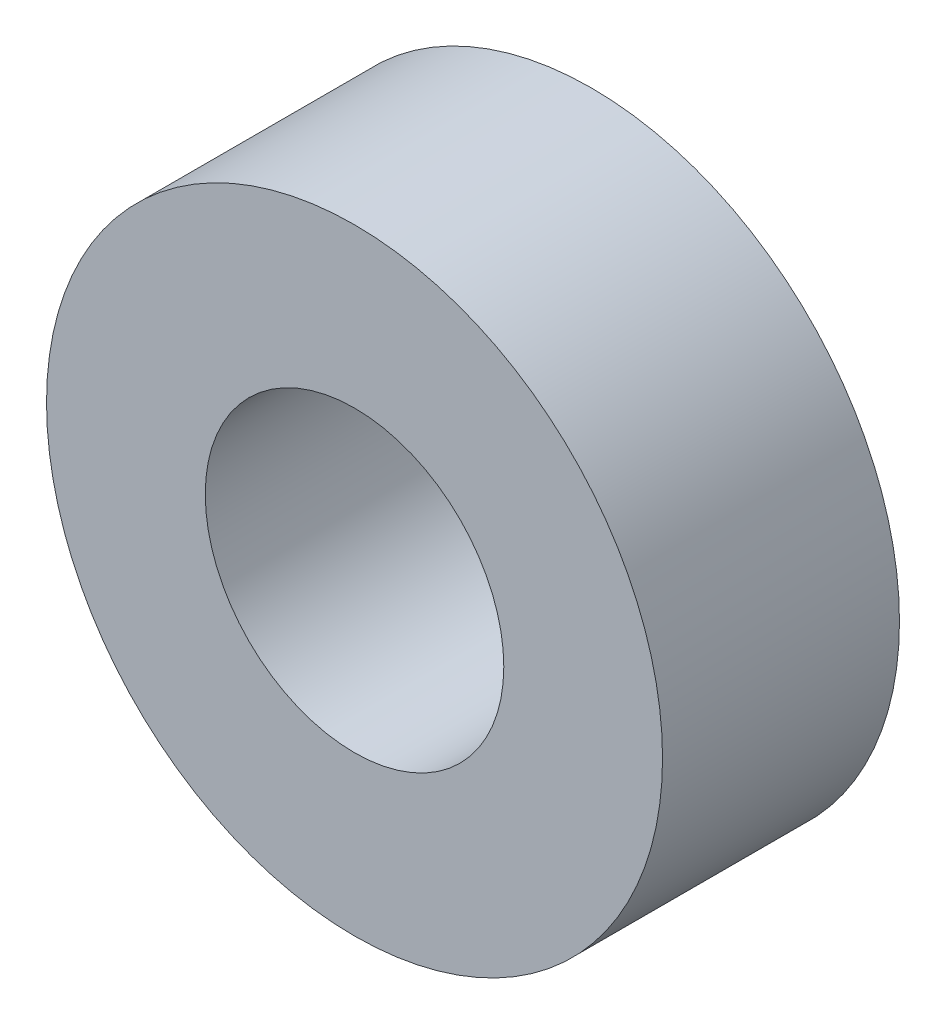
ISO-10303-21;
HEADER;
FILE_DESCRIPTION(('STEP AP214'),'2;1');
FILE_NAME('part.step','',(''),(''),'','','');
FILE_SCHEMA(('AUTOMOTIVE_DESIGN { 1 0 10303 214 1 1 1 1 }'));
ENDSEC;
DATA;
#1=APPLICATION_CONTEXT('core data for automotive mechanical design processes');
#2=APPLICATION_PROTOCOL_DEFINITION('international standard','automotive_design',2000,#1);
#3=PRODUCT_CONTEXT('',#1,'mechanical');
#4=PRODUCT('Part','Part','',(#3));
#5=PRODUCT_RELATED_PRODUCT_CATEGORY('part','',(#4));
#6=PRODUCT_DEFINITION_FORMATION('','',#4);
#7=PRODUCT_DEFINITION_CONTEXT('part definition',#1,'design');
#8=PRODUCT_DEFINITION('design','',#6,#7);
#9=PRODUCT_DEFINITION_SHAPE('','',#8);
#10=(LENGTH_UNIT() NAMED_UNIT(*) SI_UNIT(.MILLI.,.METRE.));
#11=(NAMED_UNIT(*) PLANE_ANGLE_UNIT() SI_UNIT($,.RADIAN.));
#12=(NAMED_UNIT(*) SI_UNIT($,.STERADIAN.) SOLID_ANGLE_UNIT());
#13=UNCERTAINTY_MEASURE_WITH_UNIT(LENGTH_MEASURE(1.E-05),#10,'distance_accuracy_value','');
#14=(GEOMETRIC_REPRESENTATION_CONTEXT(3) GLOBAL_UNCERTAINTY_ASSIGNED_CONTEXT((#13)) GLOBAL_UNIT_ASSIGNED_CONTEXT((#10,
#11,#12)) REPRESENTATION_CONTEXT('',''));
#15=CARTESIAN_POINT('',(0.,0.,0.));
#16=DIRECTION('',(0.,0.,1.));
#17=DIRECTION('',(1.,0.,0.));
#18=AXIS2_PLACEMENT_3D('',#15,#16,#17);
#19=CARTESIAN_POINT('',(0.,0.,2.5));
#20=DIRECTION('',(0.,0.,1.));
#21=DIRECTION('',(1.,0.,0.));
#22=AXIS2_PLACEMENT_3D('',#19,#20,#21);
#23=PLANE('',#22);
#24=CARTESIAN_POINT('',(0.,0.,2.5));
#25=DIRECTION('',(0.,0.,1.));
#26=DIRECTION('',(1.,0.,0.));
#27=AXIS2_PLACEMENT_3D('',#24,#25,#26);
#28=CIRCLE('',#27,6.5);
#29=CARTESIAN_POINT('',(6.5,0.,2.5));
#30=VERTEX_POINT('',#29);
#31=EDGE_CURVE('E10',#30,#30,#28,.T.);
#32=ORIENTED_EDGE('',*,*,#31,.T.);
#33=EDGE_LOOP('',(#32));
#34=FACE_BOUND('',#33,.T.);
#35=CARTESIAN_POINT('',(0.,0.,2.5));
#36=DIRECTION('',(0.,0.,1.));
#37=DIRECTION('',(1.,0.,0.));
#38=AXIS2_PLACEMENT_3D('',#35,#36,#37);
#39=CIRCLE('',#38,3.15);
#40=CARTESIAN_POINT('',(3.15,0.,2.5));
#41=VERTEX_POINT('',#40);
#42=EDGE_CURVE('E43',#41,#41,#39,.T.);
#43=ORIENTED_EDGE('',*,*,#42,.F.);
#44=EDGE_LOOP('',(#43));
#45=FACE_BOUND('',#44,.T.);
#46=ADVANCED_FACE('F32',(#34,#45),#23,.T.);
#47=CARTESIAN_POINT('',(0.,0.,-2.5));
#48=DIRECTION('',(0.,0.,1.));
#49=DIRECTION('',(1.,0.,0.));
#50=AXIS2_PLACEMENT_3D('',#47,#48,#49);
#51=PLANE('',#50);
#52=CARTESIAN_POINT('',(0.,0.,-2.5));
#53=DIRECTION('',(0.,0.,1.));
#54=DIRECTION('',(1.,0.,0.));
#55=AXIS2_PLACEMENT_3D('',#52,#53,#54);
#56=CIRCLE('',#55,6.5);
#57=CARTESIAN_POINT('',(6.5,0.,-2.5));
#58=VERTEX_POINT('',#57);
#59=EDGE_CURVE('E36',#58,#58,#56,.T.);
#60=ORIENTED_EDGE('',*,*,#59,.F.);
#61=EDGE_LOOP('',(#60));
#62=FACE_BOUND('',#61,.T.);
#63=CARTESIAN_POINT('',(0.,0.,-2.5));
#64=DIRECTION('',(0.,0.,1.));
#65=DIRECTION('',(1.,0.,0.));
#66=AXIS2_PLACEMENT_3D('',#63,#64,#65);
#67=CIRCLE('',#66,3.15);
#68=CARTESIAN_POINT('',(3.15,0.,-2.5));
#69=VERTEX_POINT('',#68);
#70=EDGE_CURVE('E45',#69,#69,#67,.T.);
#71=ORIENTED_EDGE('',*,*,#70,.T.);
#72=EDGE_LOOP('',(#71));
#73=FACE_BOUND('',#72,.T.);
#74=ADVANCED_FACE('F55',(#62,#73),#51,.F.);
#75=CARTESIAN_POINT('',(0.,0.,2.5));
#76=DIRECTION('',(0.,0.,-1.));
#77=DIRECTION('',(-1.,0.,0.));
#78=AXIS2_PLACEMENT_3D('',#75,#76,#77);
#79=CYLINDRICAL_SURFACE('',#78,6.5);
#80=ORIENTED_EDGE('',*,*,#31,.F.);
#81=EDGE_LOOP('',(#80));
#82=FACE_BOUND('',#81,.T.);
#83=ORIENTED_EDGE('',*,*,#59,.T.);
#84=EDGE_LOOP('',(#83));
#85=FACE_BOUND('',#84,.T.);
#86=ADVANCED_FACE('F34',(#82,#85),#79,.T.);
#87=CARTESIAN_POINT('',(0.,0.,2.5));
#88=DIRECTION('',(0.,0.,-1.));
#89=DIRECTION('',(-1.,0.,0.));
#90=AXIS2_PLACEMENT_3D('',#87,#88,#89);
#91=CYLINDRICAL_SURFACE('',#90,3.15);
#92=ORIENTED_EDGE('',*,*,#42,.T.);
#93=EDGE_LOOP('',(#92));
#94=FACE_BOUND('',#93,.T.);
#95=ORIENTED_EDGE('',*,*,#70,.F.);
#96=EDGE_LOOP('',(#95));
#97=FACE_BOUND('',#96,.T.);
#98=ADVANCED_FACE('F51',(#94,#97),#91,.F.);
#99=CLOSED_SHELL('',(#46,#74,#86,#98));
#100=MANIFOLD_SOLID_BREP('B2',#99);
#101=ADVANCED_BREP_SHAPE_REPRESENTATION('',(#18,#100),#14);
#102=SHAPE_DEFINITION_REPRESENTATION(#9,#101);
ENDSEC;
END-ISO-10303-21;
